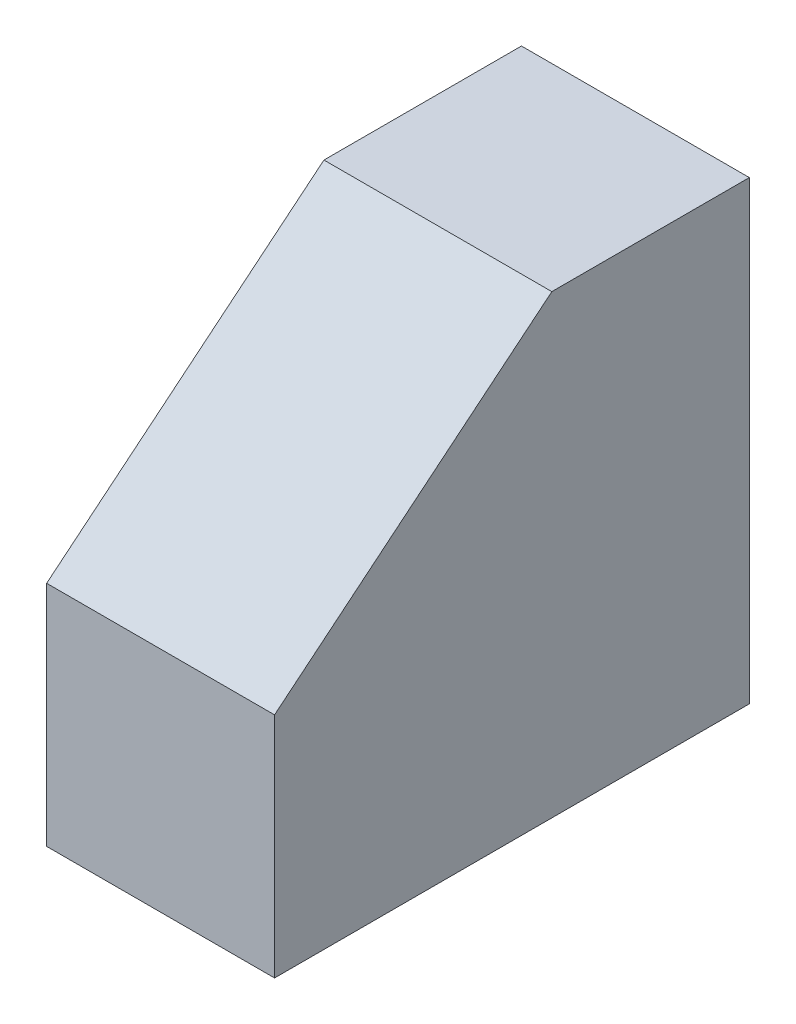
ISO-10303-21;
HEADER;
FILE_DESCRIPTION(('STEP AP214'),'2;1');
FILE_NAME('part.step','',(''),(''),'','','');
FILE_SCHEMA(('AUTOMOTIVE_DESIGN { 1 0 10303 214 1 1 1 1 }'));
ENDSEC;
DATA;
#1=APPLICATION_CONTEXT('core data for automotive mechanical design processes');
#2=APPLICATION_PROTOCOL_DEFINITION('international standard','automotive_design',2000,#1);
#3=PRODUCT_CONTEXT('',#1,'mechanical');
#4=PRODUCT('Part','Part','',(#3));
#5=PRODUCT_RELATED_PRODUCT_CATEGORY('part','',(#4));
#6=PRODUCT_DEFINITION_FORMATION('','',#4);
#7=PRODUCT_DEFINITION_CONTEXT('part definition',#1,'design');
#8=PRODUCT_DEFINITION('design','',#6,#7);
#9=PRODUCT_DEFINITION_SHAPE('','',#8);
#10=(LENGTH_UNIT() NAMED_UNIT(*) SI_UNIT(.MILLI.,.METRE.));
#11=(NAMED_UNIT(*) PLANE_ANGLE_UNIT() SI_UNIT($,.RADIAN.));
#12=(NAMED_UNIT(*) SI_UNIT($,.STERADIAN.) SOLID_ANGLE_UNIT());
#13=UNCERTAINTY_MEASURE_WITH_UNIT(LENGTH_MEASURE(1.E-05),#10,'distance_accuracy_value','');
#14=(GEOMETRIC_REPRESENTATION_CONTEXT(3) GLOBAL_UNCERTAINTY_ASSIGNED_CONTEXT((#13)) GLOBAL_UNIT_ASSIGNED_CONTEXT((#10,
#11,#12)) REPRESENTATION_CONTEXT('',''));
#15=CARTESIAN_POINT('',(0.,0.,0.));
#16=DIRECTION('',(0.,0.,1.));
#17=DIRECTION('',(1.,0.,0.));
#18=AXIS2_PLACEMENT_3D('',#15,#16,#17);
#19=CARTESIAN_POINT('',(0.,600.,0.));
#20=DIRECTION('',(1.,0.,0.));
#21=DIRECTION('',(0.,0.,-1.));
#22=AXIS2_PLACEMENT_3D('',#19,#20,#21);
#23=PLANE('',#22);
#24=DIRECTION('',(0.,-1.,0.));
#25=VECTOR('',#24,1.);
#26=CARTESIAN_POINT('',(0.,600.,0.));
#27=LINE('',#26,#25);
#28=CARTESIAN_POINT('',(0.,300.,0.));
#29=VERTEX_POINT('',#28);
#30=CARTESIAN_POINT('',(0.,0.,0.));
#31=VERTEX_POINT('',#30);
#32=EDGE_CURVE('E48',#29,#31,#27,.T.);
#33=ORIENTED_EDGE('',*,*,#32,.F.);
#34=DIRECTION('',(0.,0.634965075676551,-0.772540842073137));
#35=VECTOR('',#34,1.);
#36=CARTESIAN_POINT('',(0.,420.954194198678,-147.160936275059));
#37=LINE('',#36,#35);
#38=CARTESIAN_POINT('',(0.,600.,-365.));
#39=VERTEX_POINT('',#38);
#40=EDGE_CURVE('E105',#29,#39,#37,.T.);
#41=ORIENTED_EDGE('',*,*,#40,.T.);
#42=DIRECTION('',(0.,0.,1.));
#43=VECTOR('',#42,1.);
#44=CARTESIAN_POINT('',(0.,600.,0.));
#45=LINE('',#44,#43);
#46=CARTESIAN_POINT('',(0.,600.,-625.));
#47=VERTEX_POINT('',#46);
#48=EDGE_CURVE('E92',#47,#39,#45,.T.);
#49=ORIENTED_EDGE('',*,*,#48,.F.);
#50=DIRECTION('',(0.,-1.,0.));
#51=VECTOR('',#50,1.);
#52=CARTESIAN_POINT('',(0.,600.,-625.));
#53=LINE('',#52,#51);
#54=CARTESIAN_POINT('',(0.,0.,-625.));
#55=VERTEX_POINT('',#54);
#56=EDGE_CURVE('E85',#47,#55,#53,.T.);
#57=ORIENTED_EDGE('',*,*,#56,.T.);
#58=DIRECTION('',(0.,0.,1.));
#59=VECTOR('',#58,1.);
#60=CARTESIAN_POINT('',(0.,0.,0.));
#61=LINE('',#60,#59);
#62=EDGE_CURVE('E98',#55,#31,#61,.T.);
#63=ORIENTED_EDGE('',*,*,#62,.T.);
#64=EDGE_LOOP('',(#33,#41,#49,#57,#63));
#65=FACE_BOUND('',#64,.T.);
#66=ADVANCED_FACE('F41',(#65),#23,.F.);
#67=CARTESIAN_POINT('',(0.,600.,0.));
#68=DIRECTION('',(0.,0.,-1.));
#69=DIRECTION('',(-1.,0.,0.));
#70=AXIS2_PLACEMENT_3D('',#67,#68,#69);
#71=PLANE('',#70);
#72=DIRECTION('',(0.,-1.,0.));
#73=VECTOR('',#72,1.);
#74=CARTESIAN_POINT('',(300.,600.,0.));
#75=LINE('',#74,#73);
#76=CARTESIAN_POINT('',(300.,300.,0.));
#77=VERTEX_POINT('',#76);
#78=CARTESIAN_POINT('',(300.,0.,0.));
#79=VERTEX_POINT('',#78);
#80=EDGE_CURVE('E115',#77,#79,#75,.T.);
#81=ORIENTED_EDGE('',*,*,#80,.F.);
#82=DIRECTION('',(1.,0.,0.));
#83=VECTOR('',#82,1.);
#84=CARTESIAN_POINT('',(-300.,300.,0.));
#85=LINE('',#84,#83);
#86=EDGE_CURVE('E108',#29,#77,#85,.T.);
#87=ORIENTED_EDGE('',*,*,#86,.F.);
#88=ORIENTED_EDGE('',*,*,#32,.T.);
#89=DIRECTION('',(1.,0.,0.));
#90=VECTOR('',#89,1.);
#91=CARTESIAN_POINT('',(0.,0.,0.));
#92=LINE('',#91,#90);
#93=EDGE_CURVE('E104',#31,#79,#92,.T.);
#94=ORIENTED_EDGE('',*,*,#93,.T.);
#95=EDGE_LOOP('',(#81,#87,#88,#94));
#96=FACE_BOUND('',#95,.T.);
#97=ADVANCED_FACE('F119',(#96),#71,.F.);
#98=CARTESIAN_POINT('',(300.,600.,0.));
#99=DIRECTION('',(-1.,0.,0.));
#100=DIRECTION('',(0.,0.,1.));
#101=AXIS2_PLACEMENT_3D('',#98,#99,#100);
#102=PLANE('',#101);
#103=DIRECTION('',(0.,0.,-1.));
#104=VECTOR('',#103,1.);
#105=CARTESIAN_POINT('',(300.,600.,0.));
#106=LINE('',#105,#104);
#107=CARTESIAN_POINT('',(300.,600.,-365.));
#108=VERTEX_POINT('',#107);
#109=CARTESIAN_POINT('',(300.,600.,-625.));
#110=VERTEX_POINT('',#109);
#111=EDGE_CURVE('E130',#108,#110,#106,.T.);
#112=ORIENTED_EDGE('',*,*,#111,.F.);
#113=DIRECTION('',(0.,0.634965075676551,-0.772540842073137));
#114=VECTOR('',#113,1.);
#115=CARTESIAN_POINT('',(300.,300.,0.));
#116=LINE('',#115,#114);
#117=EDGE_CURVE('E55',#77,#108,#116,.T.);
#118=ORIENTED_EDGE('',*,*,#117,.F.);
#119=ORIENTED_EDGE('',*,*,#80,.T.);
#120=DIRECTION('',(0.,0.,-1.));
#121=VECTOR('',#120,1.);
#122=CARTESIAN_POINT('',(300.,0.,0.));
#123=LINE('',#122,#121);
#124=CARTESIAN_POINT('',(300.,0.,-625.));
#125=VERTEX_POINT('',#124);
#126=EDGE_CURVE('E93',#79,#125,#123,.T.);
#127=ORIENTED_EDGE('',*,*,#126,.T.);
#128=DIRECTION('',(0.,-1.,0.));
#129=VECTOR('',#128,1.);
#130=CARTESIAN_POINT('',(300.,600.,-625.));
#131=LINE('',#130,#129);
#132=EDGE_CURVE('E88',#110,#125,#131,.T.);
#133=ORIENTED_EDGE('',*,*,#132,.F.);
#134=EDGE_LOOP('',(#112,#118,#119,#127,#133));
#135=FACE_BOUND('',#134,.T.);
#136=ADVANCED_FACE('F129',(#135),#102,.F.);
#137=CARTESIAN_POINT('',(0.,600.,-625.));
#138=DIRECTION('',(0.,0.,1.));
#139=DIRECTION('',(1.,0.,0.));
#140=AXIS2_PLACEMENT_3D('',#137,#138,#139);
#141=PLANE('',#140);
#142=DIRECTION('',(-1.,0.,0.));
#143=VECTOR('',#142,1.);
#144=CARTESIAN_POINT('',(0.,0.,-625.));
#145=LINE('',#144,#143);
#146=EDGE_CURVE('E82',#125,#55,#145,.T.);
#147=ORIENTED_EDGE('',*,*,#146,.T.);
#148=ORIENTED_EDGE('',*,*,#56,.F.);
#149=DIRECTION('',(-1.,0.,0.));
#150=VECTOR('',#149,1.);
#151=CARTESIAN_POINT('',(0.,600.,-625.));
#152=LINE('',#151,#150);
#153=EDGE_CURVE('E63',#110,#47,#152,.T.);
#154=ORIENTED_EDGE('',*,*,#153,.F.);
#155=ORIENTED_EDGE('',*,*,#132,.T.);
#156=EDGE_LOOP('',(#147,#148,#154,#155));
#157=FACE_BOUND('',#156,.T.);
#158=ADVANCED_FACE('F84',(#157),#141,.F.);
#159=CARTESIAN_POINT('',(0.,600.,0.));
#160=DIRECTION('',(0.,-1.,0.));
#161=DIRECTION('',(0.,0.,-1.));
#162=AXIS2_PLACEMENT_3D('',#159,#160,#161);
#163=PLANE('',#162);
#164=ORIENTED_EDGE('',*,*,#48,.T.);
#165=DIRECTION('',(1.,0.,0.));
#166=VECTOR('',#165,1.);
#167=CARTESIAN_POINT('',(0.,600.,-365.));
#168=LINE('',#167,#166);
#169=EDGE_CURVE('E11',#39,#108,#168,.T.);
#170=ORIENTED_EDGE('',*,*,#169,.T.);
#171=ORIENTED_EDGE('',*,*,#111,.T.);
#172=ORIENTED_EDGE('',*,*,#153,.T.);
#173=EDGE_LOOP('',(#164,#170,#171,#172));
#174=FACE_BOUND('',#173,.T.);
#175=ADVANCED_FACE('F133',(#174),#163,.F.);
#176=CARTESIAN_POINT('',(0.,0.,0.));
#177=DIRECTION('',(0.,-1.,0.));
#178=DIRECTION('',(0.,0.,-1.));
#179=AXIS2_PLACEMENT_3D('',#176,#177,#178);
#180=PLANE('',#179);
#181=ORIENTED_EDGE('',*,*,#62,.F.);
#182=ORIENTED_EDGE('',*,*,#146,.F.);
#183=ORIENTED_EDGE('',*,*,#126,.F.);
#184=ORIENTED_EDGE('',*,*,#93,.F.);
#185=EDGE_LOOP('',(#181,#182,#183,#184));
#186=FACE_BOUND('',#185,.T.);
#187=ADVANCED_FACE('F102',(#186),#180,.T.);
#188=CARTESIAN_POINT('',(-300.,300.,0.));
#189=DIRECTION('',(0.,-0.772540842073137,-0.634965075676551));
#190=DIRECTION('',(0.,0.634965075676551,-0.772540842073137));
#191=AXIS2_PLACEMENT_3D('',#188,#189,#190);
#192=PLANE('',#191);
#193=ORIENTED_EDGE('',*,*,#86,.T.);
#194=ORIENTED_EDGE('',*,*,#117,.T.);
#195=ORIENTED_EDGE('',*,*,#169,.F.);
#196=ORIENTED_EDGE('',*,*,#40,.F.);
#197=EDGE_LOOP('',(#193,#194,#195,#196));
#198=FACE_BOUND('',#197,.T.);
#199=ADVANCED_FACE('F125',(#198),#192,.F.);
#200=CLOSED_SHELL('',(#66,#97,#136,#158,#175,#187,#199));
#201=MANIFOLD_SOLID_BREP('B2',#200);
#202=ADVANCED_BREP_SHAPE_REPRESENTATION('',(#18,#201),#14);
#203=SHAPE_DEFINITION_REPRESENTATION(#9,#202);
ENDSEC;
END-ISO-10303-21;
